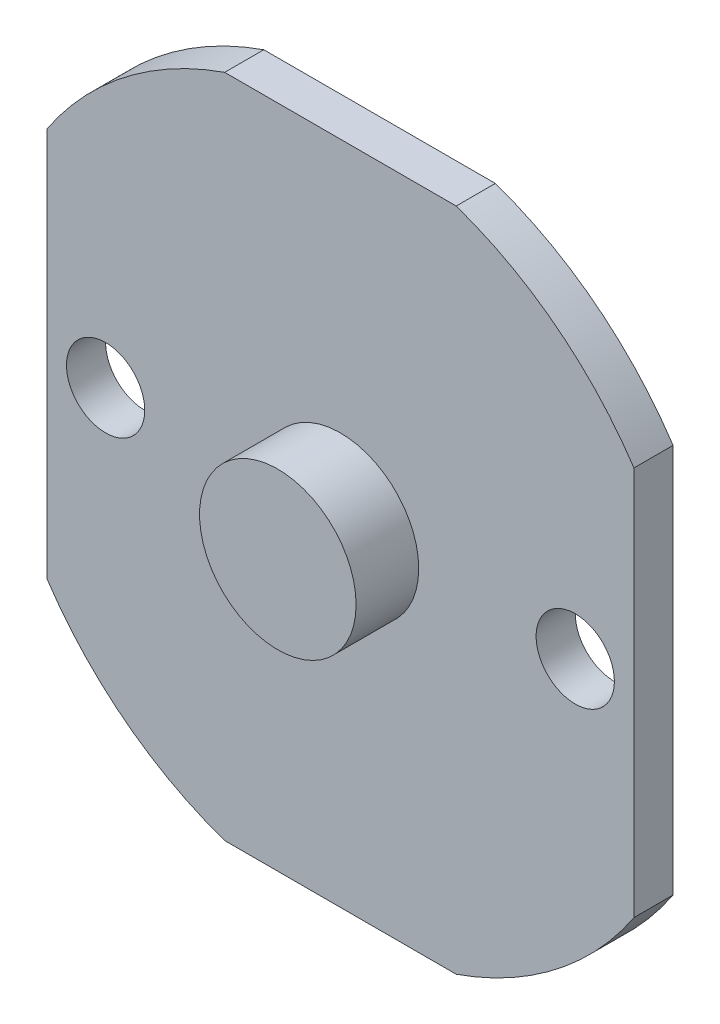
ISO-10303-21;
HEADER;
FILE_DESCRIPTION(('STEP AP214'),'2;1');
FILE_NAME('part.step','',(''),(''),'','','');
FILE_SCHEMA(('AUTOMOTIVE_DESIGN { 1 0 10303 214 1 1 1 1 }'));
ENDSEC;
DATA;
#1=APPLICATION_CONTEXT('core data for automotive mechanical design processes');
#2=APPLICATION_PROTOCOL_DEFINITION('international standard','automotive_design',2000,#1);
#3=PRODUCT_CONTEXT('',#1,'mechanical');
#4=PRODUCT('Part','Part','',(#3));
#5=PRODUCT_RELATED_PRODUCT_CATEGORY('part','',(#4));
#6=PRODUCT_DEFINITION_FORMATION('','',#4);
#7=PRODUCT_DEFINITION_CONTEXT('part definition',#1,'design');
#8=PRODUCT_DEFINITION('design','',#6,#7);
#9=PRODUCT_DEFINITION_SHAPE('','',#8);
#10=(LENGTH_UNIT() NAMED_UNIT(*) SI_UNIT(.MILLI.,.METRE.));
#11=(NAMED_UNIT(*) PLANE_ANGLE_UNIT() SI_UNIT($,.RADIAN.));
#12=(NAMED_UNIT(*) SI_UNIT($,.STERADIAN.) SOLID_ANGLE_UNIT());
#13=UNCERTAINTY_MEASURE_WITH_UNIT(LENGTH_MEASURE(1.E-05),#10,'distance_accuracy_value','');
#14=(GEOMETRIC_REPRESENTATION_CONTEXT(3) GLOBAL_UNCERTAINTY_ASSIGNED_CONTEXT((#13)) GLOBAL_UNIT_ASSIGNED_CONTEXT((#10,
#11,#12)) REPRESENTATION_CONTEXT('',''));
#15=CARTESIAN_POINT('',(0.,0.,0.));
#16=DIRECTION('',(0.,0.,1.));
#17=DIRECTION('',(1.,0.,0.));
#18=AXIS2_PLACEMENT_3D('',#15,#16,#17);
#19=CARTESIAN_POINT('',(0.,0.,1.));
#20=DIRECTION('',(0.,0.,1.));
#21=DIRECTION('',(1.,0.,0.));
#22=AXIS2_PLACEMENT_3D('',#19,#20,#21);
#23=PLANE('',#22);
#24=CARTESIAN_POINT('',(0.,0.,1.));
#25=DIRECTION('',(0.,0.,1.));
#26=DIRECTION('',(1.,0.,0.));
#27=AXIS2_PLACEMENT_3D('',#24,#25,#26);
#28=CIRCLE('',#27,2.);
#29=CARTESIAN_POINT('',(2.,0.,1.));
#30=VERTEX_POINT('',#29);
#31=EDGE_CURVE('E196',#30,#30,#28,.T.);
#32=ORIENTED_EDGE('',*,*,#31,.F.);
#33=EDGE_LOOP('',(#32));
#34=FACE_BOUND('',#33,.T.);
#35=CARTESIAN_POINT('',(6.,0.,1.));
#36=DIRECTION('',(0.,0.,1.));
#37=DIRECTION('',(1.,0.,0.));
#38=AXIS2_PLACEMENT_3D('',#35,#36,#37);
#39=CIRCLE('',#38,1.);
#40=CARTESIAN_POINT('',(7.,0.,1.));
#41=VERTEX_POINT('',#40);
#42=EDGE_CURVE('E154',#41,#41,#39,.T.);
#43=ORIENTED_EDGE('',*,*,#42,.F.);
#44=EDGE_LOOP('',(#43));
#45=FACE_BOUND('',#44,.T.);
#46=CARTESIAN_POINT('',(-6.,0.,1.));
#47=DIRECTION('',(0.,0.,1.));
#48=DIRECTION('',(1.,0.,0.));
#49=AXIS2_PLACEMENT_3D('',#46,#47,#48);
#50=CIRCLE('',#49,1.);
#51=CARTESIAN_POINT('',(-5.,0.,1.));
#52=VERTEX_POINT('',#51);
#53=EDGE_CURVE('E168',#52,#52,#50,.T.);
#54=ORIENTED_EDGE('',*,*,#53,.F.);
#55=EDGE_LOOP('',(#54));
#56=FACE_BOUND('',#55,.T.);
#57=CARTESIAN_POINT('',(0.,0.,1.));
#58=DIRECTION('',(0.,0.,1.));
#59=DIRECTION('',(1.,0.,0.));
#60=AXIS2_PLACEMENT_3D('',#57,#58,#59);
#61=CIRCLE('',#60,9.);
#62=CARTESIAN_POINT('',(2.95803989154981,-8.5,1.));
#63=VERTEX_POINT('',#62);
#64=CARTESIAN_POINT('',(7.5,-4.9749371855331,1.));
#65=VERTEX_POINT('',#64);
#66=EDGE_CURVE('E134',#63,#65,#61,.T.);
#67=ORIENTED_EDGE('',*,*,#66,.T.);
#68=DIRECTION('',(0.,1.,0.));
#69=VECTOR('',#68,1.);
#70=CARTESIAN_POINT('',(7.5,8.5,1.));
#71=LINE('',#70,#69);
#72=CARTESIAN_POINT('',(7.5,4.9749371855331,1.));
#73=VERTEX_POINT('',#72);
#74=EDGE_CURVE('E116',#65,#73,#71,.T.);
#75=ORIENTED_EDGE('',*,*,#74,.T.);
#76=CARTESIAN_POINT('',(2.9580398915498,8.5,1.));
#77=VERTEX_POINT('',#76);
#78=EDGE_CURVE('E123',#73,#77,#61,.T.);
#79=ORIENTED_EDGE('',*,*,#78,.T.);
#80=DIRECTION('',(-1.,0.,0.));
#81=VECTOR('',#80,1.);
#82=CARTESIAN_POINT('',(-7.5,8.5,1.));
#83=LINE('',#82,#81);
#84=CARTESIAN_POINT('',(-2.9580398915498,8.5,1.));
#85=VERTEX_POINT('',#84);
#86=EDGE_CURVE('E103',#77,#85,#83,.T.);
#87=ORIENTED_EDGE('',*,*,#86,.T.);
#88=CARTESIAN_POINT('',(-7.5,4.9749371855331,1.));
#89=VERTEX_POINT('',#88);
#90=EDGE_CURVE('E132',#85,#89,#61,.T.);
#91=ORIENTED_EDGE('',*,*,#90,.T.);
#92=DIRECTION('',(0.,-1.,0.));
#93=VECTOR('',#92,1.);
#94=CARTESIAN_POINT('',(-7.5,8.5,1.));
#95=LINE('',#94,#93);
#96=CARTESIAN_POINT('',(-7.5,-4.9749371855331,1.));
#97=VERTEX_POINT('',#96);
#98=EDGE_CURVE('E115',#89,#97,#95,.T.);
#99=ORIENTED_EDGE('',*,*,#98,.T.);
#100=CARTESIAN_POINT('',(-2.95803989154981,-8.5,1.));
#101=VERTEX_POINT('',#100);
#102=EDGE_CURVE('E138',#97,#101,#61,.T.);
#103=ORIENTED_EDGE('',*,*,#102,.T.);
#104=DIRECTION('',(1.,0.,0.));
#105=VECTOR('',#104,1.);
#106=CARTESIAN_POINT('',(-7.5,-8.5,1.));
#107=LINE('',#106,#105);
#108=EDGE_CURVE('E187',#101,#63,#107,.T.);
#109=ORIENTED_EDGE('',*,*,#108,.T.);
#110=EDGE_LOOP('',(#67,#75,#79,#87,#91,#99,#103,#109));
#111=FACE_BOUND('',#110,.T.);
#112=ADVANCED_FACE('F39',(#34,#45,#56,#111),#23,.T.);
#113=CARTESIAN_POINT('',(0.,0.,0.));
#114=DIRECTION('',(0.,0.,1.));
#115=DIRECTION('',(1.,0.,0.));
#116=AXIS2_PLACEMENT_3D('',#113,#114,#115);
#117=PLANE('',#116);
#118=CARTESIAN_POINT('',(6.,0.,0.));
#119=DIRECTION('',(0.,0.,1.));
#120=DIRECTION('',(1.,0.,0.));
#121=AXIS2_PLACEMENT_3D('',#118,#119,#120);
#122=CIRCLE('',#121,1.);
#123=CARTESIAN_POINT('',(7.,0.,0.));
#124=VERTEX_POINT('',#123);
#125=EDGE_CURVE('E162',#124,#124,#122,.T.);
#126=ORIENTED_EDGE('',*,*,#125,.T.);
#127=EDGE_LOOP('',(#126));
#128=FACE_BOUND('',#127,.T.);
#129=CARTESIAN_POINT('',(-6.,0.,0.));
#130=DIRECTION('',(0.,0.,1.));
#131=DIRECTION('',(1.,0.,0.));
#132=AXIS2_PLACEMENT_3D('',#129,#130,#131);
#133=CIRCLE('',#132,1.);
#134=CARTESIAN_POINT('',(-5.,0.,0.));
#135=VERTEX_POINT('',#134);
#136=EDGE_CURVE('E170',#135,#135,#133,.T.);
#137=ORIENTED_EDGE('',*,*,#136,.T.);
#138=EDGE_LOOP('',(#137));
#139=FACE_BOUND('',#138,.T.);
#140=DIRECTION('',(0.,1.,0.));
#141=VECTOR('',#140,1.);
#142=CARTESIAN_POINT('',(7.5,0.,0.));
#143=LINE('',#142,#141);
#144=CARTESIAN_POINT('',(7.5,-4.9749371855331,0.));
#145=VERTEX_POINT('',#144);
#146=CARTESIAN_POINT('',(7.5,4.9749371855331,0.));
#147=VERTEX_POINT('',#146);
#148=EDGE_CURVE('E174',#145,#147,#143,.T.);
#149=ORIENTED_EDGE('',*,*,#148,.F.);
#150=CARTESIAN_POINT('',(0.,0.,0.));
#151=DIRECTION('',(0.,0.,1.));
#152=DIRECTION('',(1.,0.,0.));
#153=AXIS2_PLACEMENT_3D('',#150,#151,#152);
#154=CIRCLE('',#153,9.);
#155=CARTESIAN_POINT('',(2.95803989154981,-8.5,0.));
#156=VERTEX_POINT('',#155);
#157=EDGE_CURVE('E148',#156,#145,#154,.T.);
#158=ORIENTED_EDGE('',*,*,#157,.F.);
#159=DIRECTION('',(1.,0.,0.));
#160=VECTOR('',#159,1.);
#161=CARTESIAN_POINT('',(0.,-8.5,0.));
#162=LINE('',#161,#160);
#163=CARTESIAN_POINT('',(-2.95803989154981,-8.5,0.));
#164=VERTEX_POINT('',#163);
#165=EDGE_CURVE('E55',#164,#156,#162,.T.);
#166=ORIENTED_EDGE('',*,*,#165,.F.);
#167=CARTESIAN_POINT('',(-7.5,-4.9749371855331,0.));
#168=VERTEX_POINT('',#167);
#169=EDGE_CURVE('E151',#168,#164,#154,.T.);
#170=ORIENTED_EDGE('',*,*,#169,.F.);
#171=DIRECTION('',(0.,-1.,0.));
#172=VECTOR('',#171,1.);
#173=CARTESIAN_POINT('',(-7.5,0.,0.));
#174=LINE('',#173,#172);
#175=CARTESIAN_POINT('',(-7.5,4.9749371855331,0.));
#176=VERTEX_POINT('',#175);
#177=EDGE_CURVE('E63',#176,#168,#174,.T.);
#178=ORIENTED_EDGE('',*,*,#177,.F.);
#179=CARTESIAN_POINT('',(-2.9580398915498,8.5,0.));
#180=VERTEX_POINT('',#179);
#181=EDGE_CURVE('E147',#180,#176,#154,.T.);
#182=ORIENTED_EDGE('',*,*,#181,.F.);
#183=DIRECTION('',(-1.,0.,0.));
#184=VECTOR('',#183,1.);
#185=CARTESIAN_POINT('',(0.,8.5,0.));
#186=LINE('',#185,#184);
#187=CARTESIAN_POINT('',(2.9580398915498,8.5,0.));
#188=VERTEX_POINT('',#187);
#189=EDGE_CURVE('E184',#188,#180,#186,.T.);
#190=ORIENTED_EDGE('',*,*,#189,.F.);
#191=EDGE_CURVE('E125',#147,#188,#154,.T.);
#192=ORIENTED_EDGE('',*,*,#191,.F.);
#193=EDGE_LOOP('',(#149,#158,#166,#170,#178,#182,#190,#192));
#194=FACE_BOUND('',#193,.T.);
#195=ADVANCED_FACE('F215',(#128,#139,#194),#117,.F.);
#196=CARTESIAN_POINT('',(0.,0.,1.));
#197=DIRECTION('',(0.,0.,-1.));
#198=DIRECTION('',(-1.,0.,0.));
#199=AXIS2_PLACEMENT_3D('',#196,#197,#198);
#200=CYLINDRICAL_SURFACE('',#199,9.);
#201=DIRECTION('',(0.,0.,-1.));
#202=VECTOR('',#201,1.);
#203=CARTESIAN_POINT('',(7.5,-4.9749371855331,1.));
#204=LINE('',#203,#202);
#205=EDGE_CURVE('E11',#65,#145,#204,.T.);
#206=ORIENTED_EDGE('',*,*,#205,.F.);
#207=ORIENTED_EDGE('',*,*,#66,.F.);
#208=DIRECTION('',(0.,0.,-1.));
#209=VECTOR('',#208,1.);
#210=CARTESIAN_POINT('',(2.95803989154981,-8.5,1.));
#211=LINE('',#210,#209);
#212=EDGE_CURVE('E235',#156,#63,#211,.F.);
#213=ORIENTED_EDGE('',*,*,#212,.F.);
#214=ORIENTED_EDGE('',*,*,#157,.T.);
#215=EDGE_LOOP('',(#206,#207,#213,#214));
#216=FACE_BOUND('',#215,.T.);
#217=ADVANCED_FACE('F41',(#216),#200,.T.);
#218=DIRECTION('',(0.,0.,-1.));
#219=VECTOR('',#218,1.);
#220=CARTESIAN_POINT('',(7.5,4.9749371855331,1.));
#221=LINE('',#220,#219);
#222=EDGE_CURVE('E48',#147,#73,#221,.F.);
#223=ORIENTED_EDGE('',*,*,#222,.F.);
#224=ORIENTED_EDGE('',*,*,#191,.T.);
#225=DIRECTION('',(0.,0.,-1.));
#226=VECTOR('',#225,1.);
#227=CARTESIAN_POINT('',(2.9580398915498,8.5,1.));
#228=LINE('',#227,#226);
#229=EDGE_CURVE('E106',#77,#188,#228,.T.);
#230=ORIENTED_EDGE('',*,*,#229,.F.);
#231=ORIENTED_EDGE('',*,*,#78,.F.);
#232=EDGE_LOOP('',(#223,#224,#230,#231));
#233=FACE_BOUND('',#232,.T.);
#234=ADVANCED_FACE('F122',(#233),#200,.T.);
#235=DIRECTION('',(0.,0.,-1.));
#236=VECTOR('',#235,1.);
#237=CARTESIAN_POINT('',(-2.95803989154981,-8.5,1.));
#238=LINE('',#237,#236);
#239=EDGE_CURVE('E233',#101,#164,#238,.T.);
#240=ORIENTED_EDGE('',*,*,#239,.F.);
#241=ORIENTED_EDGE('',*,*,#102,.F.);
#242=DIRECTION('',(0.,0.,-1.));
#243=VECTOR('',#242,1.);
#244=CARTESIAN_POINT('',(-7.5,-4.9749371855331,1.));
#245=LINE('',#244,#243);
#246=EDGE_CURVE('E127',#168,#97,#245,.F.);
#247=ORIENTED_EDGE('',*,*,#246,.F.);
#248=ORIENTED_EDGE('',*,*,#169,.T.);
#249=EDGE_LOOP('',(#240,#241,#247,#248));
#250=FACE_BOUND('',#249,.T.);
#251=ADVANCED_FACE('F250',(#250),#200,.T.);
#252=DIRECTION('',(0.,0.,-1.));
#253=VECTOR('',#252,1.);
#254=CARTESIAN_POINT('',(-7.5,4.9749371855331,1.));
#255=LINE('',#254,#253);
#256=EDGE_CURVE('E240',#89,#176,#255,.T.);
#257=ORIENTED_EDGE('',*,*,#256,.F.);
#258=ORIENTED_EDGE('',*,*,#90,.F.);
#259=DIRECTION('',(0.,0.,-1.));
#260=VECTOR('',#259,1.);
#261=CARTESIAN_POINT('',(-2.9580398915498,8.5,1.));
#262=LINE('',#261,#260);
#263=EDGE_CURVE('E109',#180,#85,#262,.F.);
#264=ORIENTED_EDGE('',*,*,#263,.F.);
#265=ORIENTED_EDGE('',*,*,#181,.T.);
#266=EDGE_LOOP('',(#257,#258,#264,#265));
#267=FACE_BOUND('',#266,.T.);
#268=ADVANCED_FACE('F254',(#267),#200,.T.);
#269=CARTESIAN_POINT('',(6.,0.,1.));
#270=DIRECTION('',(0.,0.,-1.));
#271=DIRECTION('',(-1.,0.,0.));
#272=AXIS2_PLACEMENT_3D('',#269,#270,#271);
#273=CYLINDRICAL_SURFACE('',#272,1.);
#274=ORIENTED_EDGE('',*,*,#42,.T.);
#275=EDGE_LOOP('',(#274));
#276=FACE_BOUND('',#275,.T.);
#277=ORIENTED_EDGE('',*,*,#125,.F.);
#278=EDGE_LOOP('',(#277));
#279=FACE_BOUND('',#278,.T.);
#280=ADVANCED_FACE('F223',(#276,#279),#273,.F.);
#281=CARTESIAN_POINT('',(-6.,0.,1.));
#282=DIRECTION('',(0.,0.,-1.));
#283=DIRECTION('',(-1.,0.,0.));
#284=AXIS2_PLACEMENT_3D('',#281,#282,#283);
#285=CYLINDRICAL_SURFACE('',#284,1.);
#286=ORIENTED_EDGE('',*,*,#53,.T.);
#287=EDGE_LOOP('',(#286));
#288=FACE_BOUND('',#287,.T.);
#289=ORIENTED_EDGE('',*,*,#136,.F.);
#290=EDGE_LOOP('',(#289));
#291=FACE_BOUND('',#290,.T.);
#292=ADVANCED_FACE('F220',(#288,#291),#285,.F.);
#293=CARTESIAN_POINT('',(-7.5,8.5,-1.));
#294=DIRECTION('',(0.,1.,0.));
#295=DIRECTION('',(0.,0.,1.));
#296=AXIS2_PLACEMENT_3D('',#293,#294,#295);
#297=PLANE('',#296);
#298=ORIENTED_EDGE('',*,*,#229,.T.);
#299=ORIENTED_EDGE('',*,*,#189,.T.);
#300=ORIENTED_EDGE('',*,*,#263,.T.);
#301=ORIENTED_EDGE('',*,*,#86,.F.);
#302=EDGE_LOOP('',(#298,#299,#300,#301));
#303=FACE_BOUND('',#302,.T.);
#304=ADVANCED_FACE('F105',(#303),#297,.T.);
#305=CARTESIAN_POINT('',(-7.5,8.5,-1.));
#306=DIRECTION('',(-1.,0.,0.));
#307=DIRECTION('',(0.,0.,1.));
#308=AXIS2_PLACEMENT_3D('',#305,#306,#307);
#309=PLANE('',#308);
#310=ORIENTED_EDGE('',*,*,#256,.T.);
#311=ORIENTED_EDGE('',*,*,#177,.T.);
#312=ORIENTED_EDGE('',*,*,#246,.T.);
#313=ORIENTED_EDGE('',*,*,#98,.F.);
#314=EDGE_LOOP('',(#310,#311,#312,#313));
#315=FACE_BOUND('',#314,.T.);
#316=ADVANCED_FACE('F244',(#315),#309,.T.);
#317=CARTESIAN_POINT('',(-7.5,-8.5,-1.));
#318=DIRECTION('',(0.,-1.,0.));
#319=DIRECTION('',(0.,0.,-1.));
#320=AXIS2_PLACEMENT_3D('',#317,#318,#319);
#321=PLANE('',#320);
#322=ORIENTED_EDGE('',*,*,#239,.T.);
#323=ORIENTED_EDGE('',*,*,#165,.T.);
#324=ORIENTED_EDGE('',*,*,#212,.T.);
#325=ORIENTED_EDGE('',*,*,#108,.F.);
#326=EDGE_LOOP('',(#322,#323,#324,#325));
#327=FACE_BOUND('',#326,.T.);
#328=ADVANCED_FACE('F251',(#327),#321,.T.);
#329=CARTESIAN_POINT('',(7.5,8.5,-1.));
#330=DIRECTION('',(1.,0.,0.));
#331=DIRECTION('',(0.,0.,-1.));
#332=AXIS2_PLACEMENT_3D('',#329,#330,#331);
#333=PLANE('',#332);
#334=ORIENTED_EDGE('',*,*,#205,.T.);
#335=ORIENTED_EDGE('',*,*,#148,.T.);
#336=ORIENTED_EDGE('',*,*,#222,.T.);
#337=ORIENTED_EDGE('',*,*,#74,.F.);
#338=EDGE_LOOP('',(#334,#335,#336,#337));
#339=FACE_BOUND('',#338,.T.);
#340=ADVANCED_FACE('F209',(#339),#333,.T.);
#341=CARTESIAN_POINT('',(0.,0.,2.6));
#342=DIRECTION('',(0.,0.,-1.));
#343=DIRECTION('',(-1.,0.,0.));
#344=AXIS2_PLACEMENT_3D('',#341,#342,#343);
#345=CYLINDRICAL_SURFACE('',#344,2.);
#346=CARTESIAN_POINT('',(0.,0.,2.6));
#347=DIRECTION('',(0.,0.,1.));
#348=DIRECTION('',(1.,0.,0.));
#349=AXIS2_PLACEMENT_3D('',#346,#347,#348);
#350=CIRCLE('',#349,2.);
#351=CARTESIAN_POINT('',(2.,0.,2.6));
#352=VERTEX_POINT('',#351);
#353=EDGE_CURVE('E195',#352,#352,#350,.T.);
#354=ORIENTED_EDGE('',*,*,#353,.F.);
#355=EDGE_LOOP('',(#354));
#356=FACE_BOUND('',#355,.T.);
#357=ORIENTED_EDGE('',*,*,#31,.T.);
#358=EDGE_LOOP('',(#357));
#359=FACE_BOUND('',#358,.T.);
#360=ADVANCED_FACE('F206',(#356,#359),#345,.T.);
#361=CARTESIAN_POINT('',(0.,0.,2.6));
#362=DIRECTION('',(0.,0.,1.));
#363=DIRECTION('',(1.,0.,0.));
#364=AXIS2_PLACEMENT_3D('',#361,#362,#363);
#365=PLANE('',#364);
#366=ORIENTED_EDGE('',*,*,#353,.T.);
#367=EDGE_LOOP('',(#366));
#368=FACE_BOUND('',#367,.T.);
#369=ADVANCED_FACE('F204',(#368),#365,.T.);
#370=CLOSED_SHELL('',(#112,#195,#217,#234,#251,#268,#280,#292,#304,#316,#328,#340,#360,#369));
#371=MANIFOLD_SOLID_BREP('B2',#370);
#372=ADVANCED_BREP_SHAPE_REPRESENTATION('',(#18,#371),#14);
#373=SHAPE_DEFINITION_REPRESENTATION(#9,#372);
ENDSEC;
END-ISO-10303-21;
